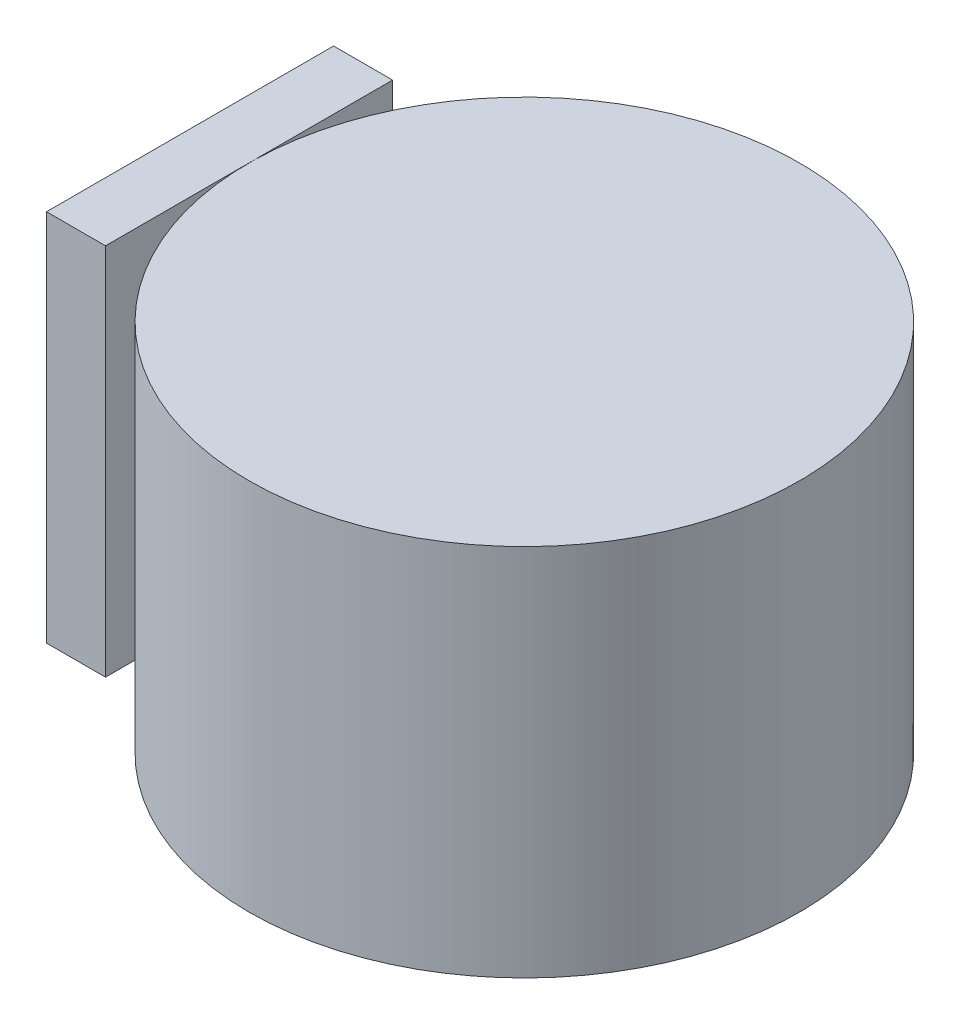
ISO-10303-21;
HEADER;
FILE_DESCRIPTION(('STEP AP214'),'2;1');
FILE_NAME('part.step','',(''),(''),'','','');
FILE_SCHEMA(('AUTOMOTIVE_DESIGN { 1 0 10303 214 1 1 1 1 }'));
ENDSEC;
DATA;
#1=APPLICATION_CONTEXT('core data for automotive mechanical design processes');
#2=APPLICATION_PROTOCOL_DEFINITION('international standard','automotive_design',2000,#1);
#3=PRODUCT_CONTEXT('',#1,'mechanical');
#4=PRODUCT('Part','Part','',(#3));
#5=PRODUCT_RELATED_PRODUCT_CATEGORY('part','',(#4));
#6=PRODUCT_DEFINITION_FORMATION('','',#4);
#7=PRODUCT_DEFINITION_CONTEXT('part definition',#1,'design');
#8=PRODUCT_DEFINITION('design','',#6,#7);
#9=PRODUCT_DEFINITION_SHAPE('','',#8);
#10=(LENGTH_UNIT() NAMED_UNIT(*) SI_UNIT(.MILLI.,.METRE.));
#11=(NAMED_UNIT(*) PLANE_ANGLE_UNIT() SI_UNIT($,.RADIAN.));
#12=(NAMED_UNIT(*) SI_UNIT($,.STERADIAN.) SOLID_ANGLE_UNIT());
#13=UNCERTAINTY_MEASURE_WITH_UNIT(LENGTH_MEASURE(1.E-05),#10,'distance_accuracy_value','');
#14=(GEOMETRIC_REPRESENTATION_CONTEXT(3) GLOBAL_UNCERTAINTY_ASSIGNED_CONTEXT((#13)) GLOBAL_UNIT_ASSIGNED_CONTEXT((#10,
#11,#12)) REPRESENTATION_CONTEXT('',''));
#15=CARTESIAN_POINT('',(0.,0.,0.));
#16=DIRECTION('',(0.,0.,1.));
#17=DIRECTION('',(1.,0.,0.));
#18=AXIS2_PLACEMENT_3D('',#15,#16,#17);
#19=CARTESIAN_POINT('',(-17.,0.,-7.3));
#20=DIRECTION('',(-1.,0.,0.));
#21=DIRECTION('',(0.,0.,1.));
#22=AXIS2_PLACEMENT_3D('',#19,#20,#21);
#23=PLANE('',#22);
#24=DIRECTION('',(0.,0.,1.));
#25=VECTOR('',#24,1.);
#26=CARTESIAN_POINT('',(-17.,0.,-7.3));
#27=LINE('',#26,#25);
#28=CARTESIAN_POINT('',(-17.,0.,-7.3));
#29=VERTEX_POINT('',#28);
#30=CARTESIAN_POINT('',(-17.,0.,7.3));
#31=VERTEX_POINT('',#30);
#32=EDGE_CURVE('E46',#29,#31,#27,.T.);
#33=ORIENTED_EDGE('',*,*,#32,.T.);
#34=DIRECTION('',(0.,-1.,0.));
#35=VECTOR('',#34,1.);
#36=CARTESIAN_POINT('',(-17.,0.,7.3));
#37=LINE('',#36,#35);
#38=CARTESIAN_POINT('',(-17.,19.,7.3));
#39=VERTEX_POINT('',#38);
#40=EDGE_CURVE('E83',#39,#31,#37,.T.);
#41=ORIENTED_EDGE('',*,*,#40,.F.);
#42=DIRECTION('',(0.,0.,1.));
#43=VECTOR('',#42,1.);
#44=CARTESIAN_POINT('',(-17.,19.,-7.3));
#45=LINE('',#44,#43);
#46=CARTESIAN_POINT('',(-17.,19.,-7.3));
#47=VERTEX_POINT('',#46);
#48=EDGE_CURVE('E12',#47,#39,#45,.T.);
#49=ORIENTED_EDGE('',*,*,#48,.F.);
#50=DIRECTION('',(0.,-1.,0.));
#51=VECTOR('',#50,1.);
#52=CARTESIAN_POINT('',(-17.,0.,-7.3));
#53=LINE('',#52,#51);
#54=EDGE_CURVE('E84',#47,#29,#53,.T.);
#55=ORIENTED_EDGE('',*,*,#54,.T.);
#56=EDGE_LOOP('',(#33,#41,#49,#55));
#57=FACE_BOUND('',#56,.T.);
#58=ADVANCED_FACE('F43',(#57),#23,.T.);
#59=CARTESIAN_POINT('',(-17.,19.,-7.3));
#60=DIRECTION('',(0.,1.,0.));
#61=DIRECTION('',(0.,0.,1.));
#62=AXIS2_PLACEMENT_3D('',#59,#60,#61);
#63=PLANE('',#62);
#64=ORIENTED_EDGE('',*,*,#48,.T.);
#65=DIRECTION('',(-1.,0.,0.));
#66=VECTOR('',#65,1.);
#67=CARTESIAN_POINT('',(-17.,19.,7.3));
#68=LINE('',#67,#66);
#69=CARTESIAN_POINT('',(-14.,19.,7.3));
#70=VERTEX_POINT('',#69);
#71=EDGE_CURVE('E100',#70,#39,#68,.T.);
#72=ORIENTED_EDGE('',*,*,#71,.F.);
#73=DIRECTION('',(0.,0.,1.));
#74=VECTOR('',#73,1.);
#75=CARTESIAN_POINT('',(-14.,19.,-7.3));
#76=LINE('',#75,#74);
#77=CARTESIAN_POINT('',(-14.,19.,-7.3));
#78=VERTEX_POINT('',#77);
#79=EDGE_CURVE('E51',#78,#70,#76,.T.);
#80=ORIENTED_EDGE('',*,*,#79,.F.);
#81=DIRECTION('',(-1.,0.,0.));
#82=VECTOR('',#81,1.);
#83=CARTESIAN_POINT('',(-17.,19.,-7.3));
#84=LINE('',#83,#82);
#85=EDGE_CURVE('E89',#78,#47,#84,.T.);
#86=ORIENTED_EDGE('',*,*,#85,.T.);
#87=EDGE_LOOP('',(#64,#72,#80,#86));
#88=FACE_BOUND('',#87,.T.);
#89=ADVANCED_FACE('F115',(#88),#63,.T.);
#90=CARTESIAN_POINT('',(-14.,0.,-7.3));
#91=DIRECTION('',(1.,0.,0.));
#92=DIRECTION('',(0.,0.,-1.));
#93=AXIS2_PLACEMENT_3D('',#90,#91,#92);
#94=PLANE('',#93);
#95=ORIENTED_EDGE('',*,*,#79,.T.);
#96=DIRECTION('',(0.,1.,0.));
#97=VECTOR('',#96,1.);
#98=CARTESIAN_POINT('',(-14.,0.,7.3));
#99=LINE('',#98,#97);
#100=CARTESIAN_POINT('',(-14.,0.,7.3));
#101=VERTEX_POINT('',#100);
#102=EDGE_CURVE('E96',#101,#70,#99,.T.);
#103=ORIENTED_EDGE('',*,*,#102,.F.);
#104=DIRECTION('',(0.,0.,1.));
#105=VECTOR('',#104,1.);
#106=CARTESIAN_POINT('',(-14.,0.,-7.3));
#107=LINE('',#106,#105);
#108=CARTESIAN_POINT('',(-14.,0.,-7.3));
#109=VERTEX_POINT('',#108);
#110=EDGE_CURVE('E88',#109,#101,#107,.T.);
#111=ORIENTED_EDGE('',*,*,#110,.F.);
#112=DIRECTION('',(0.,1.,0.));
#113=VECTOR('',#112,1.);
#114=CARTESIAN_POINT('',(-14.,0.,-7.3));
#115=LINE('',#114,#113);
#116=EDGE_CURVE('E108',#109,#78,#115,.T.);
#117=ORIENTED_EDGE('',*,*,#116,.T.);
#118=EDGE_LOOP('',(#95,#103,#111,#117));
#119=FACE_BOUND('',#118,.T.);
#120=ADVANCED_FACE('F112',(#119),#94,.T.);
#121=CARTESIAN_POINT('',(-17.,0.,-7.3));
#122=DIRECTION('',(0.,-1.,0.));
#123=DIRECTION('',(0.,0.,-1.));
#124=AXIS2_PLACEMENT_3D('',#121,#122,#123);
#125=PLANE('',#124);
#126=ORIENTED_EDGE('',*,*,#110,.T.);
#127=DIRECTION('',(1.,0.,0.));
#128=VECTOR('',#127,1.);
#129=CARTESIAN_POINT('',(-17.,0.,7.3));
#130=LINE('',#129,#128);
#131=EDGE_CURVE('E91',#31,#101,#130,.T.);
#132=ORIENTED_EDGE('',*,*,#131,.F.);
#133=ORIENTED_EDGE('',*,*,#32,.F.);
#134=DIRECTION('',(1.,0.,0.));
#135=VECTOR('',#134,1.);
#136=CARTESIAN_POINT('',(-17.,0.,-7.3));
#137=LINE('',#136,#135);
#138=EDGE_CURVE('E106',#29,#109,#137,.T.);
#139=ORIENTED_EDGE('',*,*,#138,.T.);
#140=EDGE_LOOP('',(#126,#132,#133,#139));
#141=FACE_BOUND('',#140,.T.);
#142=ADVANCED_FACE('F92',(#141),#125,.T.);
#143=CARTESIAN_POINT('',(0.,0.,-7.3));
#144=DIRECTION('',(0.,0.,-1.));
#145=DIRECTION('',(-1.,0.,0.));
#146=AXIS2_PLACEMENT_3D('',#143,#144,#145);
#147=PLANE('',#146);
#148=ORIENTED_EDGE('',*,*,#54,.F.);
#149=ORIENTED_EDGE('',*,*,#85,.F.);
#150=ORIENTED_EDGE('',*,*,#116,.F.);
#151=ORIENTED_EDGE('',*,*,#138,.F.);
#152=EDGE_LOOP('',(#148,#149,#150,#151));
#153=FACE_BOUND('',#152,.T.);
#154=ADVANCED_FACE('F117',(#153),#147,.T.);
#155=CARTESIAN_POINT('',(0.,0.,7.3));
#156=DIRECTION('',(0.,0.,-1.));
#157=DIRECTION('',(-1.,0.,0.));
#158=AXIS2_PLACEMENT_3D('',#155,#156,#157);
#159=PLANE('',#158);
#160=ORIENTED_EDGE('',*,*,#40,.T.);
#161=ORIENTED_EDGE('',*,*,#131,.T.);
#162=ORIENTED_EDGE('',*,*,#102,.T.);
#163=ORIENTED_EDGE('',*,*,#71,.T.);
#164=EDGE_LOOP('',(#160,#161,#162,#163));
#165=FACE_BOUND('',#164,.T.);
#166=ADVANCED_FACE('F99',(#165),#159,.F.);
#167=CLOSED_SHELL('',(#58,#89,#120,#142,#154,#166));
#168=MANIFOLD_SOLID_BREP('B2',#167);
#169=CARTESIAN_POINT('',(0.,19.,0.));
#170=DIRECTION('',(0.,-1.,0.));
#171=DIRECTION('',(0.,0.,-1.));
#172=AXIS2_PLACEMENT_3D('',#169,#170,#171);
#173=CYLINDRICAL_SURFACE('',#172,14.);
#174=CARTESIAN_POINT('',(0.,0.,0.));
#175=DIRECTION('',(0.,1.,0.));
#176=DIRECTION('',(0.,0.,1.));
#177=AXIS2_PLACEMENT_3D('',#174,#175,#176);
#178=CIRCLE('',#177,14.);
#179=CARTESIAN_POINT('',(0.,0.,14.));
#180=VERTEX_POINT('',#179);
#181=EDGE_CURVE('E170',#180,#180,#178,.T.);
#182=ORIENTED_EDGE('',*,*,#181,.T.);
#183=EDGE_LOOP('',(#182));
#184=FACE_BOUND('',#183,.T.);
#185=CARTESIAN_POINT('',(0.,19.,0.));
#186=DIRECTION('',(0.,1.,0.));
#187=DIRECTION('',(0.,0.,1.));
#188=AXIS2_PLACEMENT_3D('',#185,#186,#187);
#189=CIRCLE('',#188,14.);
#190=CARTESIAN_POINT('',(0.,19.,14.));
#191=VERTEX_POINT('',#190);
#192=EDGE_CURVE('E42',#191,#191,#189,.T.);
#193=ORIENTED_EDGE('',*,*,#192,.F.);
#194=EDGE_LOOP('',(#193));
#195=FACE_BOUND('',#194,.T.);
#196=ADVANCED_FACE('F167',(#184,#195),#173,.T.);
#197=CARTESIAN_POINT('',(0.,19.,0.));
#198=DIRECTION('',(0.,1.,0.));
#199=DIRECTION('',(0.,0.,1.));
#200=AXIS2_PLACEMENT_3D('',#197,#198,#199);
#201=PLANE('',#200);
#202=ORIENTED_EDGE('',*,*,#192,.T.);
#203=EDGE_LOOP('',(#202));
#204=FACE_BOUND('',#203,.T.);
#205=ADVANCED_FACE('F183',(#204),#201,.T.);
#206=CARTESIAN_POINT('',(0.,0.,0.));
#207=DIRECTION('',(0.,1.,0.));
#208=DIRECTION('',(0.,0.,1.));
#209=AXIS2_PLACEMENT_3D('',#206,#207,#208);
#210=PLANE('',#209);
#211=ORIENTED_EDGE('',*,*,#181,.F.);
#212=EDGE_LOOP('',(#211));
#213=FACE_BOUND('',#212,.T.);
#214=ADVANCED_FACE('F181',(#213),#210,.F.);
#215=CLOSED_SHELL('',(#196,#205,#214));
#216=MANIFOLD_SOLID_BREP('B6',#215);
#217=ADVANCED_BREP_SHAPE_REPRESENTATION('',(#18,#168,#216),#14);
#218=SHAPE_DEFINITION_REPRESENTATION(#9,#217);
ENDSEC;
END-ISO-10303-21;
